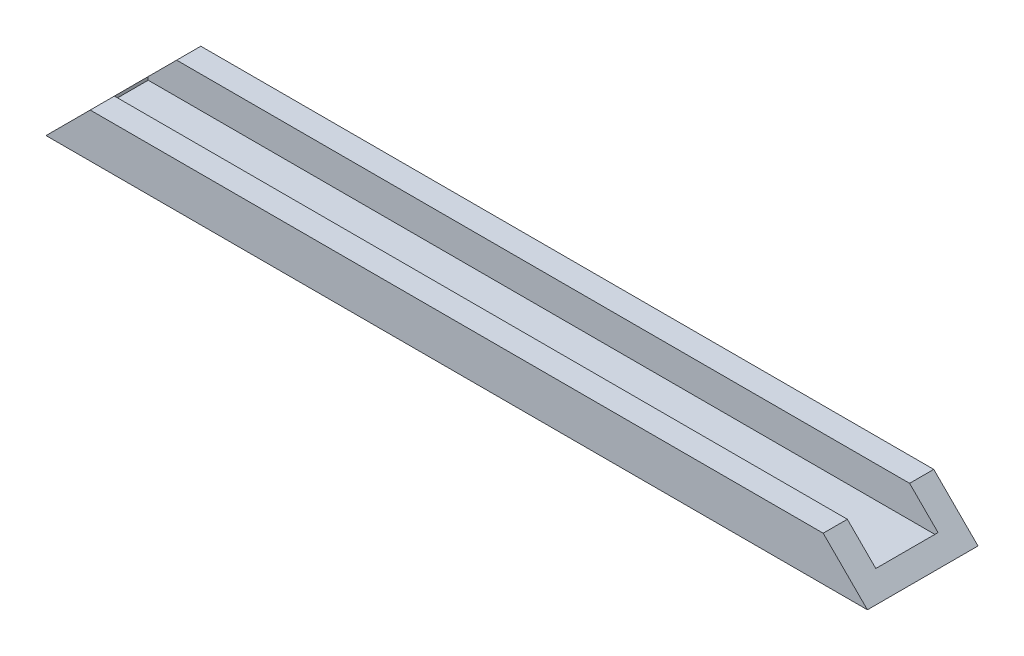
ISO-10303-21;
HEADER;
FILE_DESCRIPTION(('STEP AP214'),'2;1');
FILE_NAME('part.step','',(''),(''),'','','');
FILE_SCHEMA(('AUTOMOTIVE_DESIGN { 1 0 10303 214 1 1 1 1 }'));
ENDSEC;
DATA;
#1=APPLICATION_CONTEXT('core data for automotive mechanical design processes');
#2=APPLICATION_PROTOCOL_DEFINITION('international standard','automotive_design',2000,#1);
#3=PRODUCT_CONTEXT('',#1,'mechanical');
#4=PRODUCT('Part','Part','',(#3));
#5=PRODUCT_RELATED_PRODUCT_CATEGORY('part','',(#4));
#6=PRODUCT_DEFINITION_FORMATION('','',#4);
#7=PRODUCT_DEFINITION_CONTEXT('part definition',#1,'design');
#8=PRODUCT_DEFINITION('design','',#6,#7);
#9=PRODUCT_DEFINITION_SHAPE('','',#8);
#10=(LENGTH_UNIT() NAMED_UNIT(*) SI_UNIT(.MILLI.,.METRE.));
#11=(NAMED_UNIT(*) PLANE_ANGLE_UNIT() SI_UNIT($,.RADIAN.));
#12=(NAMED_UNIT(*) SI_UNIT($,.STERADIAN.) SOLID_ANGLE_UNIT());
#13=UNCERTAINTY_MEASURE_WITH_UNIT(LENGTH_MEASURE(1.E-05),#10,'distance_accuracy_value','');
#14=(GEOMETRIC_REPRESENTATION_CONTEXT(3) GLOBAL_UNCERTAINTY_ASSIGNED_CONTEXT((#13)) GLOBAL_UNIT_ASSIGNED_CONTEXT((#10,
#11,#12)) REPRESENTATION_CONTEXT('',''));
#15=CARTESIAN_POINT('',(0.,0.,0.));
#16=DIRECTION('',(0.,0.,1.));
#17=DIRECTION('',(1.,0.,0.));
#18=AXIS2_PLACEMENT_3D('',#15,#16,#17);
#19=CARTESIAN_POINT('',(0.,8.89,0.));
#20=DIRECTION('',(0.,-1.,0.));
#21=DIRECTION('',(0.,0.,-1.));
#22=AXIS2_PLACEMENT_3D('',#19,#20,#21);
#23=PLANE('',#22);
#24=DIRECTION('',(-1.,0.,0.));
#25=VECTOR('',#24,1.);
#26=CARTESIAN_POINT('',(0.,8.89,-22.225));
#27=LINE('',#26,#25);
#28=CARTESIAN_POINT('',(156.21,8.89000000000001,-22.225));
#29=VERTEX_POINT('',#28);
#30=CARTESIAN_POINT('',(8.89000000000009,8.89000000000001,-22.225));
#31=VERTEX_POINT('',#30);
#32=EDGE_CURVE('E129',#29,#31,#27,.T.);
#33=ORIENTED_EDGE('',*,*,#32,.T.);
#34=DIRECTION('',(0.,0.,-1.));
#35=VECTOR('',#34,1.);
#36=CARTESIAN_POINT('',(8.89000000000009,8.89000000000001,0.));
#37=LINE('',#36,#35);
#38=CARTESIAN_POINT('',(8.89000000000009,8.89000000000001,-17.36725));
#39=VERTEX_POINT('',#38);
#40=EDGE_CURVE('E115',#39,#31,#37,.T.);
#41=ORIENTED_EDGE('',*,*,#40,.F.);
#42=DIRECTION('',(-1.,0.,0.));
#43=VECTOR('',#42,1.);
#44=CARTESIAN_POINT('',(3.175,8.89,-17.36725));
#45=LINE('',#44,#43);
#46=CARTESIAN_POINT('',(156.21,8.89000000000001,-17.36725));
#47=VERTEX_POINT('',#46);
#48=EDGE_CURVE('E164',#47,#39,#45,.T.);
#49=ORIENTED_EDGE('',*,*,#48,.F.);
#50=DIRECTION('',(0.,0.,-1.));
#51=VECTOR('',#50,1.);
#52=CARTESIAN_POINT('',(156.21,8.89000000000001,0.));
#53=LINE('',#52,#51);
#54=EDGE_CURVE('E188',#47,#29,#53,.T.);
#55=ORIENTED_EDGE('',*,*,#54,.T.);
#56=EDGE_LOOP('',(#33,#41,#49,#55));
#57=FACE_BOUND('',#56,.T.);
#58=ADVANCED_FACE('F33',(#57),#23,.F.);
#59=CARTESIAN_POINT('',(0.,8.89,0.));
#60=DIRECTION('',(0.,0.,-1.));
#61=DIRECTION('',(-1.,0.,0.));
#62=AXIS2_PLACEMENT_3D('',#59,#60,#61);
#63=PLANE('',#62);
#64=DIRECTION('',(1.,0.,0.));
#65=VECTOR('',#64,1.);
#66=CARTESIAN_POINT('',(0.,8.89,0.));
#67=LINE('',#66,#65);
#68=CARTESIAN_POINT('',(8.89000000000009,8.89000000000001,0.));
#69=VERTEX_POINT('',#68);
#70=CARTESIAN_POINT('',(156.21,8.89000000000001,0.));
#71=VERTEX_POINT('',#70);
#72=EDGE_CURVE('E123',#69,#71,#67,.T.);
#73=ORIENTED_EDGE('',*,*,#72,.F.);
#74=DIRECTION('',(-0.707106781186551,-0.707106781186544,0.));
#75=VECTOR('',#74,1.);
#76=CARTESIAN_POINT('',(0.,0.,0.));
#77=LINE('',#76,#75);
#78=CARTESIAN_POINT('',(0.,0.,0.));
#79=VERTEX_POINT('',#78);
#80=EDGE_CURVE('E107',#69,#79,#77,.T.);
#81=ORIENTED_EDGE('',*,*,#80,.T.);
#82=DIRECTION('',(1.,0.,0.));
#83=VECTOR('',#82,1.);
#84=CARTESIAN_POINT('',(0.,0.,0.));
#85=LINE('',#84,#83);
#86=CARTESIAN_POINT('',(165.1,0.,0.));
#87=VERTEX_POINT('',#86);
#88=EDGE_CURVE('E142',#79,#87,#85,.T.);
#89=ORIENTED_EDGE('',*,*,#88,.T.);
#90=DIRECTION('',(-0.707106781186551,0.707106781186544,0.));
#91=VECTOR('',#90,1.);
#92=CARTESIAN_POINT('',(165.1,0.,0.));
#93=LINE('',#92,#91);
#94=EDGE_CURVE('E128',#87,#71,#93,.T.);
#95=ORIENTED_EDGE('',*,*,#94,.T.);
#96=EDGE_LOOP('',(#73,#81,#89,#95));
#97=FACE_BOUND('',#96,.T.);
#98=ADVANCED_FACE('F35',(#97),#63,.F.);
#99=CARTESIAN_POINT('',(0.,8.89,-22.225));
#100=DIRECTION('',(0.,0.,1.));
#101=DIRECTION('',(1.,0.,0.));
#102=AXIS2_PLACEMENT_3D('',#99,#100,#101);
#103=PLANE('',#102);
#104=DIRECTION('',(-1.,0.,0.));
#105=VECTOR('',#104,1.);
#106=CARTESIAN_POINT('',(0.,0.,-22.225));
#107=LINE('',#106,#105);
#108=CARTESIAN_POINT('',(165.1,0.,-22.225));
#109=VERTEX_POINT('',#108);
#110=CARTESIAN_POINT('',(0.,0.,-22.225));
#111=VERTEX_POINT('',#110);
#112=EDGE_CURVE('E130',#109,#111,#107,.T.);
#113=ORIENTED_EDGE('',*,*,#112,.T.);
#114=DIRECTION('',(-0.707106781186551,-0.707106781186544,0.));
#115=VECTOR('',#114,1.);
#116=CARTESIAN_POINT('',(0.,0.,-22.225));
#117=LINE('',#116,#115);
#118=EDGE_CURVE('E116',#31,#111,#117,.T.);
#119=ORIENTED_EDGE('',*,*,#118,.F.);
#120=ORIENTED_EDGE('',*,*,#32,.F.);
#121=DIRECTION('',(-0.707106781186551,0.707106781186544,0.));
#122=VECTOR('',#121,1.);
#123=CARTESIAN_POINT('',(165.1,0.,-22.225));
#124=LINE('',#123,#122);
#125=EDGE_CURVE('E189',#109,#29,#124,.T.);
#126=ORIENTED_EDGE('',*,*,#125,.F.);
#127=EDGE_LOOP('',(#113,#119,#120,#126));
#128=FACE_BOUND('',#127,.T.);
#129=ADVANCED_FACE('F198',(#128),#103,.F.);
#130=DIRECTION('',(1.,0.,0.));
#131=VECTOR('',#130,1.);
#132=CARTESIAN_POINT('',(3.175,8.89,-4.85775));
#133=LINE('',#132,#131);
#134=CARTESIAN_POINT('',(8.89000000000009,8.89,-4.85775));
#135=VERTEX_POINT('',#134);
#136=CARTESIAN_POINT('',(156.21,8.89000000000001,-4.85774999999998));
#137=VERTEX_POINT('',#136);
#138=EDGE_CURVE('E125',#135,#137,#133,.T.);
#139=ORIENTED_EDGE('',*,*,#138,.F.);
#140=EDGE_CURVE('E56',#69,#135,#37,.T.);
#141=ORIENTED_EDGE('',*,*,#140,.F.);
#142=ORIENTED_EDGE('',*,*,#72,.T.);
#143=EDGE_CURVE('E186',#71,#137,#53,.T.);
#144=ORIENTED_EDGE('',*,*,#143,.T.);
#145=EDGE_LOOP('',(#139,#141,#142,#144));
#146=FACE_BOUND('',#145,.T.);
#147=ADVANCED_FACE('F121',(#146),#23,.F.);
#148=CARTESIAN_POINT('',(0.,0.,0.));
#149=DIRECTION('',(0.,-1.,0.));
#150=DIRECTION('',(0.,0.,-1.));
#151=AXIS2_PLACEMENT_3D('',#148,#149,#150);
#152=PLANE('',#151);
#153=DIRECTION('',(0.,0.,1.));
#154=VECTOR('',#153,1.);
#155=CARTESIAN_POINT('',(0.,0.,0.));
#156=LINE('',#155,#154);
#157=EDGE_CURVE('E110',#111,#79,#156,.T.);
#158=ORIENTED_EDGE('',*,*,#157,.F.);
#159=ORIENTED_EDGE('',*,*,#112,.F.);
#160=DIRECTION('',(0.,0.,-1.));
#161=VECTOR('',#160,1.);
#162=CARTESIAN_POINT('',(165.1,0.,0.));
#163=LINE('',#162,#161);
#164=EDGE_CURVE('E135',#87,#109,#163,.T.);
#165=ORIENTED_EDGE('',*,*,#164,.F.);
#166=ORIENTED_EDGE('',*,*,#88,.F.);
#167=EDGE_LOOP('',(#158,#159,#165,#166));
#168=FACE_BOUND('',#167,.T.);
#169=ADVANCED_FACE('F201',(#168),#152,.T.);
#170=CARTESIAN_POINT('',(3.175,2.54,-17.36725));
#171=DIRECTION('',(-1.,0.,0.));
#172=DIRECTION('',(0.,0.,1.));
#173=AXIS2_PLACEMENT_3D('',#170,#171,#172);
#174=PLANE('',#173);
#175=DIRECTION('',(0.,1.,0.));
#176=VECTOR('',#175,1.);
#177=CARTESIAN_POINT('',(3.175,2.54,-17.36725));
#178=LINE('',#177,#176);
#179=CARTESIAN_POINT('',(3.175,2.54,-17.36725));
#180=VERTEX_POINT('',#179);
#181=CARTESIAN_POINT('',(3.175,3.17499999999998,-17.36725));
#182=VERTEX_POINT('',#181);
#183=EDGE_CURVE('E143',#180,#182,#178,.T.);
#184=ORIENTED_EDGE('',*,*,#183,.T.);
#185=DIRECTION('',(0.,0.,1.));
#186=VECTOR('',#185,1.);
#187=CARTESIAN_POINT('',(3.175,3.17499999999998,-17.36725));
#188=LINE('',#187,#186);
#189=CARTESIAN_POINT('',(3.175,3.17499999999998,-4.85775));
#190=VERTEX_POINT('',#189);
#191=EDGE_CURVE('E179',#182,#190,#188,.T.);
#192=ORIENTED_EDGE('',*,*,#191,.T.);
#193=DIRECTION('',(0.,1.,0.));
#194=VECTOR('',#193,1.);
#195=CARTESIAN_POINT('',(3.175,2.54,-4.85775));
#196=LINE('',#195,#194);
#197=CARTESIAN_POINT('',(3.175,2.54,-4.85775));
#198=VERTEX_POINT('',#197);
#199=EDGE_CURVE('E138',#198,#190,#196,.T.);
#200=ORIENTED_EDGE('',*,*,#199,.F.);
#201=DIRECTION('',(0.,0.,1.));
#202=VECTOR('',#201,1.);
#203=CARTESIAN_POINT('',(3.175,2.54,-17.36725));
#204=LINE('',#203,#202);
#205=EDGE_CURVE('E167',#180,#198,#204,.T.);
#206=ORIENTED_EDGE('',*,*,#205,.F.);
#207=EDGE_LOOP('',(#184,#192,#200,#206));
#208=FACE_BOUND('',#207,.T.);
#209=ADVANCED_FACE('F213',(#208),#174,.F.);
#210=CARTESIAN_POINT('',(3.175,2.54,-17.36725));
#211=DIRECTION('',(0.,0.,-1.));
#212=DIRECTION('',(-1.,0.,0.));
#213=AXIS2_PLACEMENT_3D('',#210,#211,#212);
#214=PLANE('',#213);
#215=ORIENTED_EDGE('',*,*,#48,.T.);
#216=DIRECTION('',(-0.707106781186551,-0.707106781186544,0.));
#217=VECTOR('',#216,1.);
#218=CARTESIAN_POINT('',(2.85750000000001,2.85749999999999,-17.36725));
#219=LINE('',#218,#217);
#220=EDGE_CURVE('E169',#39,#182,#219,.T.);
#221=ORIENTED_EDGE('',*,*,#220,.T.);
#222=ORIENTED_EDGE('',*,*,#183,.F.);
#223=DIRECTION('',(-1.,0.,0.));
#224=VECTOR('',#223,1.);
#225=CARTESIAN_POINT('',(3.175,2.54,-17.36725));
#226=LINE('',#225,#224);
#227=CARTESIAN_POINT('',(161.925,2.54,-17.36725));
#228=VERTEX_POINT('',#227);
#229=EDGE_CURVE('E160',#228,#180,#226,.T.);
#230=ORIENTED_EDGE('',*,*,#229,.F.);
#231=DIRECTION('',(0.,1.,0.));
#232=VECTOR('',#231,1.);
#233=CARTESIAN_POINT('',(161.925,2.54,-17.36725));
#234=LINE('',#233,#232);
#235=CARTESIAN_POINT('',(161.925,3.17499999999993,-17.36725));
#236=VERTEX_POINT('',#235);
#237=EDGE_CURVE('E158',#228,#236,#234,.T.);
#238=ORIENTED_EDGE('',*,*,#237,.T.);
#239=DIRECTION('',(-0.707106781186551,0.707106781186544,0.));
#240=VECTOR('',#239,1.);
#241=CARTESIAN_POINT('',(82.8674999999992,82.2325,-17.36725));
#242=LINE('',#241,#240);
#243=EDGE_CURVE('E182',#236,#47,#242,.T.);
#244=ORIENTED_EDGE('',*,*,#243,.T.);
#245=EDGE_LOOP('',(#215,#221,#222,#230,#238,#244));
#246=FACE_BOUND('',#245,.T.);
#247=ADVANCED_FACE('F207',(#246),#214,.F.);
#248=CARTESIAN_POINT('',(161.925,2.54,-17.36725));
#249=DIRECTION('',(1.,0.,0.));
#250=DIRECTION('',(0.,0.,-1.));
#251=AXIS2_PLACEMENT_3D('',#248,#249,#250);
#252=PLANE('',#251);
#253=DIRECTION('',(0.,1.,0.));
#254=VECTOR('',#253,1.);
#255=CARTESIAN_POINT('',(161.925,2.54,-4.85774999999998));
#256=LINE('',#255,#254);
#257=CARTESIAN_POINT('',(161.925,2.54,-4.85774999999998));
#258=VERTEX_POINT('',#257);
#259=CARTESIAN_POINT('',(161.925,3.17499999999988,-4.85774999999998));
#260=VERTEX_POINT('',#259);
#261=EDGE_CURVE('E150',#258,#260,#256,.T.);
#262=ORIENTED_EDGE('',*,*,#261,.T.);
#263=DIRECTION('',(0.,0.,-1.));
#264=VECTOR('',#263,1.);
#265=CARTESIAN_POINT('',(161.925,3.17499999999993,-17.36725));
#266=LINE('',#265,#264);
#267=EDGE_CURVE('E48',#260,#236,#266,.T.);
#268=ORIENTED_EDGE('',*,*,#267,.T.);
#269=ORIENTED_EDGE('',*,*,#237,.F.);
#270=DIRECTION('',(0.,0.,-1.));
#271=VECTOR('',#270,1.);
#272=CARTESIAN_POINT('',(161.925,2.54,-17.36725));
#273=LINE('',#272,#271);
#274=EDGE_CURVE('E156',#258,#228,#273,.T.);
#275=ORIENTED_EDGE('',*,*,#274,.F.);
#276=EDGE_LOOP('',(#262,#268,#269,#275));
#277=FACE_BOUND('',#276,.T.);
#278=ADVANCED_FACE('F153',(#277),#252,.F.);
#279=CARTESIAN_POINT('',(3.175,2.54,-4.85775));
#280=DIRECTION('',(0.,0.,1.));
#281=DIRECTION('',(1.,0.,0.));
#282=AXIS2_PLACEMENT_3D('',#279,#280,#281);
#283=PLANE('',#282);
#284=ORIENTED_EDGE('',*,*,#199,.T.);
#285=DIRECTION('',(0.707106781186551,0.707106781186544,0.));
#286=VECTOR('',#285,1.);
#287=CARTESIAN_POINT('',(2.85750000000001,2.85749999999999,-4.85775));
#288=LINE('',#287,#286);
#289=EDGE_CURVE('E11',#190,#135,#288,.T.);
#290=ORIENTED_EDGE('',*,*,#289,.T.);
#291=ORIENTED_EDGE('',*,*,#138,.T.);
#292=DIRECTION('',(0.707106781186551,-0.707106781186544,0.));
#293=VECTOR('',#292,1.);
#294=CARTESIAN_POINT('',(82.8674999999992,82.2325,-4.85774999999999));
#295=LINE('',#294,#293);
#296=EDGE_CURVE('E41',#137,#260,#295,.T.);
#297=ORIENTED_EDGE('',*,*,#296,.T.);
#298=ORIENTED_EDGE('',*,*,#261,.F.);
#299=DIRECTION('',(1.,0.,0.));
#300=VECTOR('',#299,1.);
#301=CARTESIAN_POINT('',(3.175,2.54,-4.85775));
#302=LINE('',#301,#300);
#303=EDGE_CURVE('E173',#198,#258,#302,.T.);
#304=ORIENTED_EDGE('',*,*,#303,.F.);
#305=EDGE_LOOP('',(#284,#290,#291,#297,#298,#304));
#306=FACE_BOUND('',#305,.T.);
#307=ADVANCED_FACE('F148',(#306),#283,.F.);
#308=CARTESIAN_POINT('',(0.,2.54,0.));
#309=DIRECTION('',(0.,1.,0.));
#310=DIRECTION('',(0.,0.,1.));
#311=AXIS2_PLACEMENT_3D('',#308,#309,#310);
#312=PLANE('',#311);
#313=ORIENTED_EDGE('',*,*,#205,.T.);
#314=ORIENTED_EDGE('',*,*,#303,.T.);
#315=ORIENTED_EDGE('',*,*,#274,.T.);
#316=ORIENTED_EDGE('',*,*,#229,.T.);
#317=EDGE_LOOP('',(#313,#314,#315,#316));
#318=FACE_BOUND('',#317,.T.);
#319=ADVANCED_FACE('F210',(#318),#312,.T.);
#320=CARTESIAN_POINT('',(165.1,0.,0.));
#321=DIRECTION('',(-0.707106781186544,-0.707106781186551,0.));
#322=DIRECTION('',(0.707106781186551,-0.707106781186544,0.));
#323=AXIS2_PLACEMENT_3D('',#320,#321,#322);
#324=PLANE('',#323);
#325=ORIENTED_EDGE('',*,*,#267,.F.);
#326=ORIENTED_EDGE('',*,*,#296,.F.);
#327=ORIENTED_EDGE('',*,*,#143,.F.);
#328=ORIENTED_EDGE('',*,*,#94,.F.);
#329=ORIENTED_EDGE('',*,*,#164,.T.);
#330=ORIENTED_EDGE('',*,*,#125,.T.);
#331=ORIENTED_EDGE('',*,*,#54,.F.);
#332=ORIENTED_EDGE('',*,*,#243,.F.);
#333=EDGE_LOOP('',(#325,#326,#327,#328,#329,#330,#331,#332));
#334=FACE_BOUND('',#333,.T.);
#335=ADVANCED_FACE('F202',(#334),#324,.F.);
#336=CARTESIAN_POINT('',(0.,0.,0.));
#337=DIRECTION('',(0.707106781186544,-0.707106781186551,0.));
#338=DIRECTION('',(0.707106781186551,0.707106781186544,0.));
#339=AXIS2_PLACEMENT_3D('',#336,#337,#338);
#340=PLANE('',#339);
#341=ORIENTED_EDGE('',*,*,#40,.T.);
#342=ORIENTED_EDGE('',*,*,#118,.T.);
#343=ORIENTED_EDGE('',*,*,#157,.T.);
#344=ORIENTED_EDGE('',*,*,#80,.F.);
#345=ORIENTED_EDGE('',*,*,#140,.T.);
#346=ORIENTED_EDGE('',*,*,#289,.F.);
#347=ORIENTED_EDGE('',*,*,#191,.F.);
#348=ORIENTED_EDGE('',*,*,#220,.F.);
#349=EDGE_LOOP('',(#341,#342,#343,#344,#345,#346,#347,#348));
#350=FACE_BOUND('',#349,.T.);
#351=ADVANCED_FACE('F108',(#350),#340,.F.);
#352=CLOSED_SHELL('',(#58,#98,#129,#147,#169,#209,#247,#278,#307,#319,#335,#351));
#353=MANIFOLD_SOLID_BREP('B2',#352);
#354=ADVANCED_BREP_SHAPE_REPRESENTATION('',(#18,#353),#14);
#355=SHAPE_DEFINITION_REPRESENTATION(#9,#354);
ENDSEC;
END-ISO-10303-21;
